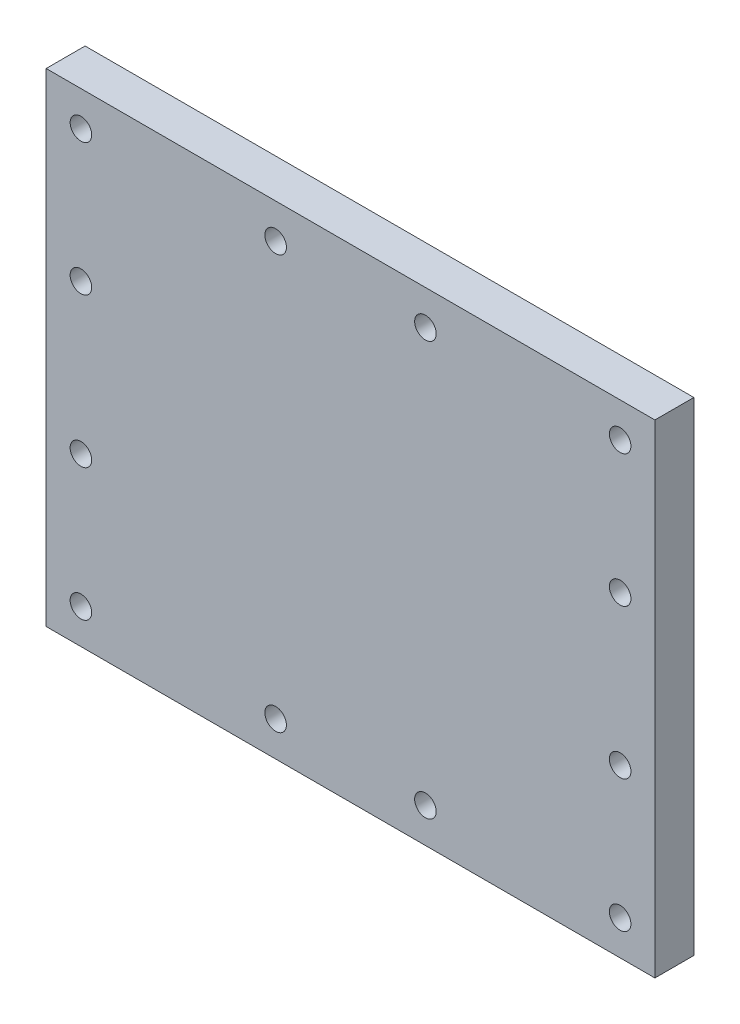
ISO-10303-21;
HEADER;
FILE_DESCRIPTION(('STEP AP214'),'2;1');
FILE_NAME('part.step','',(''),(''),'','','');
FILE_SCHEMA(('AUTOMOTIVE_DESIGN { 1 0 10303 214 1 1 1 1 }'));
ENDSEC;
DATA;
#1=APPLICATION_CONTEXT('core data for automotive mechanical design processes');
#2=APPLICATION_PROTOCOL_DEFINITION('international standard','automotive_design',2000,#1);
#3=PRODUCT_CONTEXT('',#1,'mechanical');
#4=PRODUCT('Part','Part','',(#3));
#5=PRODUCT_RELATED_PRODUCT_CATEGORY('part','',(#4));
#6=PRODUCT_DEFINITION_FORMATION('','',#4);
#7=PRODUCT_DEFINITION_CONTEXT('part definition',#1,'design');
#8=PRODUCT_DEFINITION('design','',#6,#7);
#9=PRODUCT_DEFINITION_SHAPE('','',#8);
#10=(LENGTH_UNIT() NAMED_UNIT(*) SI_UNIT(.MILLI.,.METRE.));
#11=(NAMED_UNIT(*) PLANE_ANGLE_UNIT() SI_UNIT($,.RADIAN.));
#12=(NAMED_UNIT(*) SI_UNIT($,.STERADIAN.) SOLID_ANGLE_UNIT());
#13=UNCERTAINTY_MEASURE_WITH_UNIT(LENGTH_MEASURE(1.E-05),#10,'distance_accuracy_value','');
#14=(GEOMETRIC_REPRESENTATION_CONTEXT(3) GLOBAL_UNCERTAINTY_ASSIGNED_CONTEXT((#13)) GLOBAL_UNIT_ASSIGNED_CONTEXT((#10,
#11,#12)) REPRESENTATION_CONTEXT('',''));
#15=CARTESIAN_POINT('',(0.,0.,0.));
#16=DIRECTION('',(0.,0.,1.));
#17=DIRECTION('',(1.,0.,0.));
#18=AXIS2_PLACEMENT_3D('',#15,#16,#17);
#19=CARTESIAN_POINT('',(-58.1243128246472,36.2443544247679,-5.51040500289528));
#20=DIRECTION('',(1.,0.,0.));
#21=DIRECTION('',(0.,1.,0.));
#22=AXIS2_PLACEMENT_3D('',#19,#20,#21);
#23=PLANE('',#22);
#24=DIRECTION('',(0.,-1.,0.));
#25=VECTOR('',#24,1.);
#26=CARTESIAN_POINT('',(-58.1243128246472,36.2443544247679,-11.1104050028953));
#27=LINE('',#26,#25);
#28=CARTESIAN_POINT('',(-58.1243128246472,105.741954424767,-11.1104050028953));
#29=VERTEX_POINT('',#28);
#30=CARTESIAN_POINT('',(-58.1243128246472,36.2443544247679,-11.1104050028953));
#31=VERTEX_POINT('',#30);
#32=EDGE_CURVE('E98',#29,#31,#27,.T.);
#33=ORIENTED_EDGE('',*,*,#32,.F.);
#34=DIRECTION('',(0.,0.,-1.));
#35=VECTOR('',#34,1.);
#36=CARTESIAN_POINT('',(-58.1243128246472,105.741954424767,-5.51040500289528));
#37=LINE('',#36,#35);
#38=CARTESIAN_POINT('',(-58.1243128246472,105.741954424767,-5.51040500289528));
#39=VERTEX_POINT('',#38);
#40=EDGE_CURVE('E11',#39,#29,#37,.T.);
#41=ORIENTED_EDGE('',*,*,#40,.F.);
#42=DIRECTION('',(0.,-1.,0.));
#43=VECTOR('',#42,1.);
#44=CARTESIAN_POINT('',(-58.1243128246472,36.2443544247679,-5.51040500289528));
#45=LINE('',#44,#43);
#46=CARTESIAN_POINT('',(-58.1243128246472,36.2443544247679,-5.51040500289528));
#47=VERTEX_POINT('',#46);
#48=EDGE_CURVE('E91',#39,#47,#45,.T.);
#49=ORIENTED_EDGE('',*,*,#48,.T.);
#50=DIRECTION('',(0.,0.,-1.));
#51=VECTOR('',#50,1.);
#52=CARTESIAN_POINT('',(-58.1243128246472,36.2443544247679,-5.51040500289528));
#53=LINE('',#52,#51);
#54=EDGE_CURVE('E36',#47,#31,#53,.T.);
#55=ORIENTED_EDGE('',*,*,#54,.T.);
#56=EDGE_LOOP('',(#33,#41,#49,#55));
#57=FACE_BOUND('',#56,.T.);
#58=ADVANCED_FACE('F33',(#57),#23,.T.);
#59=CARTESIAN_POINT('',(-58.1243128246472,105.741954424767,-5.51040500289528));
#60=DIRECTION('',(0.,1.,0.));
#61=DIRECTION('',(-1.,0.,0.));
#62=AXIS2_PLACEMENT_3D('',#59,#60,#61);
#63=PLANE('',#62);
#64=DIRECTION('',(1.,0.,0.));
#65=VECTOR('',#64,1.);
#66=CARTESIAN_POINT('',(-58.1243128246472,105.741954424767,-11.1104050028953));
#67=LINE('',#66,#65);
#68=CARTESIAN_POINT('',(-145.664312824647,105.741954424767,-11.1104050028953));
#69=VERTEX_POINT('',#68);
#70=EDGE_CURVE('E93',#69,#29,#67,.T.);
#71=ORIENTED_EDGE('',*,*,#70,.F.);
#72=DIRECTION('',(0.,0.,-1.));
#73=VECTOR('',#72,1.);
#74=CARTESIAN_POINT('',(-145.664312824647,105.741954424767,-5.51040500289528));
#75=LINE('',#74,#73);
#76=CARTESIAN_POINT('',(-145.664312824647,105.741954424767,-5.51040500289528));
#77=VERTEX_POINT('',#76);
#78=EDGE_CURVE('E42',#77,#69,#75,.T.);
#79=ORIENTED_EDGE('',*,*,#78,.F.);
#80=DIRECTION('',(1.,0.,0.));
#81=VECTOR('',#80,1.);
#82=CARTESIAN_POINT('',(-58.1243128246472,105.741954424767,-5.51040500289528));
#83=LINE('',#82,#81);
#84=EDGE_CURVE('E88',#77,#39,#83,.T.);
#85=ORIENTED_EDGE('',*,*,#84,.T.);
#86=ORIENTED_EDGE('',*,*,#40,.T.);
#87=EDGE_LOOP('',(#71,#79,#85,#86));
#88=FACE_BOUND('',#87,.T.);
#89=ADVANCED_FACE('F109',(#88),#63,.T.);
#90=CARTESIAN_POINT('',(-145.664312824647,36.2443544247679,-5.51040500289528));
#91=DIRECTION('',(-1.,0.,0.));
#92=DIRECTION('',(0.,0.,1.));
#93=AXIS2_PLACEMENT_3D('',#90,#91,#92);
#94=PLANE('',#93);
#95=DIRECTION('',(0.,1.,0.));
#96=VECTOR('',#95,1.);
#97=CARTESIAN_POINT('',(-145.664312824647,36.2443544247679,-11.1104050028953));
#98=LINE('',#97,#96);
#99=CARTESIAN_POINT('',(-145.664312824647,36.2443544247679,-11.1104050028953));
#100=VERTEX_POINT('',#99);
#101=EDGE_CURVE('E83',#100,#69,#98,.T.);
#102=ORIENTED_EDGE('',*,*,#101,.F.);
#103=DIRECTION('',(0.,0.,-1.));
#104=VECTOR('',#103,1.);
#105=CARTESIAN_POINT('',(-145.664312824647,36.2443544247679,-5.51040500289528));
#106=LINE('',#105,#104);
#107=CARTESIAN_POINT('',(-145.664312824647,36.2443544247679,-5.51040500289528));
#108=VERTEX_POINT('',#107);
#109=EDGE_CURVE('E78',#108,#100,#106,.T.);
#110=ORIENTED_EDGE('',*,*,#109,.F.);
#111=DIRECTION('',(0.,1.,0.));
#112=VECTOR('',#111,1.);
#113=CARTESIAN_POINT('',(-145.664312824647,36.2443544247679,-5.51040500289528));
#114=LINE('',#113,#112);
#115=EDGE_CURVE('E81',#108,#77,#114,.T.);
#116=ORIENTED_EDGE('',*,*,#115,.T.);
#117=ORIENTED_EDGE('',*,*,#78,.T.);
#118=EDGE_LOOP('',(#102,#110,#116,#117));
#119=FACE_BOUND('',#118,.T.);
#120=ADVANCED_FACE('F80',(#119),#94,.T.);
#121=CARTESIAN_POINT('',(-58.1243128246472,36.2443544247679,-5.51040500289528));
#122=DIRECTION('',(0.,-1.,0.));
#123=DIRECTION('',(1.,0.,0.));
#124=AXIS2_PLACEMENT_3D('',#121,#122,#123);
#125=PLANE('',#124);
#126=DIRECTION('',(-1.,0.,0.));
#127=VECTOR('',#126,1.);
#128=CARTESIAN_POINT('',(-58.1243128246472,36.2443544247679,-11.1104050028953));
#129=LINE('',#128,#127);
#130=EDGE_CURVE('E101',#31,#100,#129,.T.);
#131=ORIENTED_EDGE('',*,*,#130,.F.);
#132=ORIENTED_EDGE('',*,*,#54,.F.);
#133=DIRECTION('',(-1.,0.,0.));
#134=VECTOR('',#133,1.);
#135=CARTESIAN_POINT('',(-58.1243128246472,36.2443544247679,-5.51040500289528));
#136=LINE('',#135,#134);
#137=EDGE_CURVE('E87',#47,#108,#136,.T.);
#138=ORIENTED_EDGE('',*,*,#137,.T.);
#139=ORIENTED_EDGE('',*,*,#109,.T.);
#140=EDGE_LOOP('',(#131,#132,#138,#139));
#141=FACE_BOUND('',#140,.T.);
#142=ADVANCED_FACE('F90',(#141),#125,.T.);
#143=CARTESIAN_POINT('',(0.,0.,-5.51040500289528));
#144=DIRECTION('',(0.,0.,1.));
#145=DIRECTION('',(1.,0.,0.));
#146=AXIS2_PLACEMENT_3D('',#143,#144,#145);
#147=PLANE('',#146);
#148=CARTESIAN_POINT('',(-63.1243128246471,60.2443544247679,-5.51040500289528));
#149=DIRECTION('',(0.,0.,-1.));
#150=DIRECTION('',(-1.,0.,0.));
#151=AXIS2_PLACEMENT_3D('',#148,#149,#150);
#152=CIRCLE('',#151,1.54999999999999);
#153=CARTESIAN_POINT('',(-64.6743128246471,60.2443544247679,-5.51040500289528));
#154=VERTEX_POINT('',#153);
#155=EDGE_CURVE('E182',#154,#154,#152,.T.);
#156=ORIENTED_EDGE('',*,*,#155,.T.);
#157=EDGE_LOOP('',(#156));
#158=FACE_BOUND('',#157,.T.);
#159=CARTESIAN_POINT('',(-91.1243128246472,41.2443544247679,-5.51040500289528));
#160=DIRECTION('',(0.,0.,-1.));
#161=DIRECTION('',(-1.,0.,0.));
#162=AXIS2_PLACEMENT_3D('',#159,#160,#161);
#163=CIRCLE('',#162,1.54999999999999);
#164=CARTESIAN_POINT('',(-92.6743128246472,41.2443544247679,-5.51040500289528));
#165=VERTEX_POINT('',#164);
#166=EDGE_CURVE('E190',#165,#165,#163,.T.);
#167=ORIENTED_EDGE('',*,*,#166,.T.);
#168=EDGE_LOOP('',(#167));
#169=FACE_BOUND('',#168,.T.);
#170=CARTESIAN_POINT('',(-63.1243128246472,41.2443544247679,-5.51040500289528));
#171=DIRECTION('',(0.,0.,-1.));
#172=DIRECTION('',(-1.,0.,0.));
#173=AXIS2_PLACEMENT_3D('',#170,#171,#172);
#174=CIRCLE('',#173,1.54999999999999);
#175=CARTESIAN_POINT('',(-64.6743128246472,41.2443544247679,-5.51040500289528));
#176=VERTEX_POINT('',#175);
#177=EDGE_CURVE('E196',#176,#176,#174,.T.);
#178=ORIENTED_EDGE('',*,*,#177,.T.);
#179=EDGE_LOOP('',(#178));
#180=FACE_BOUND('',#179,.T.);
#181=CARTESIAN_POINT('',(-140.664312824647,81.7419544247674,-5.51040500289528));
#182=DIRECTION('',(0.,0.,-1.));
#183=DIRECTION('',(-1.,0.,0.));
#184=AXIS2_PLACEMENT_3D('',#181,#182,#183);
#185=CIRCLE('',#184,1.54999999999999);
#186=CARTESIAN_POINT('',(-142.214312824647,81.7419544247674,-5.51040500289528));
#187=VERTEX_POINT('',#186);
#188=EDGE_CURVE('E202',#187,#187,#185,.T.);
#189=ORIENTED_EDGE('',*,*,#188,.T.);
#190=EDGE_LOOP('',(#189));
#191=FACE_BOUND('',#190,.T.);
#192=CARTESIAN_POINT('',(-112.664312824647,100.741954424767,-5.51040500289528));
#193=DIRECTION('',(0.,0.,-1.));
#194=DIRECTION('',(-1.,0.,0.));
#195=AXIS2_PLACEMENT_3D('',#192,#193,#194);
#196=CIRCLE('',#195,1.54999999999999);
#197=CARTESIAN_POINT('',(-114.214312824647,100.741954424767,-5.51040500289528));
#198=VERTEX_POINT('',#197);
#199=EDGE_CURVE('E208',#198,#198,#196,.T.);
#200=ORIENTED_EDGE('',*,*,#199,.T.);
#201=EDGE_LOOP('',(#200));
#202=FACE_BOUND('',#201,.T.);
#203=CARTESIAN_POINT('',(-140.664312824647,100.741954424767,-5.51040500289528));
#204=DIRECTION('',(0.,0.,-1.));
#205=DIRECTION('',(-1.,0.,0.));
#206=AXIS2_PLACEMENT_3D('',#203,#204,#205);
#207=CIRCLE('',#206,1.54999999999999);
#208=CARTESIAN_POINT('',(-142.214312824647,100.741954424767,-5.51040500289528));
#209=VERTEX_POINT('',#208);
#210=EDGE_CURVE('E214',#209,#209,#207,.T.);
#211=ORIENTED_EDGE('',*,*,#210,.T.);
#212=EDGE_LOOP('',(#211));
#213=FACE_BOUND('',#212,.T.);
#214=CARTESIAN_POINT('',(-140.664312824647,41.2443544247679,-5.51040500289528));
#215=DIRECTION('',(0.,0.,-1.));
#216=DIRECTION('',(1.,0.,0.));
#217=AXIS2_PLACEMENT_3D('',#214,#215,#216);
#218=CIRCLE('',#217,1.54999999999999);
#219=CARTESIAN_POINT('',(-139.114312824647,41.2443544247679,-5.51040500289528));
#220=VERTEX_POINT('',#219);
#221=EDGE_CURVE('E220',#220,#220,#218,.T.);
#222=ORIENTED_EDGE('',*,*,#221,.T.);
#223=EDGE_LOOP('',(#222));
#224=FACE_BOUND('',#223,.T.);
#225=CARTESIAN_POINT('',(-112.664312824647,41.2443544247679,-5.51040500289528));
#226=DIRECTION('',(0.,0.,-1.));
#227=DIRECTION('',(1.,0.,0.));
#228=AXIS2_PLACEMENT_3D('',#225,#226,#227);
#229=CIRCLE('',#228,1.54999999999999);
#230=CARTESIAN_POINT('',(-111.114312824647,41.2443544247679,-5.51040500289528));
#231=VERTEX_POINT('',#230);
#232=EDGE_CURVE('E226',#231,#231,#229,.T.);
#233=ORIENTED_EDGE('',*,*,#232,.T.);
#234=EDGE_LOOP('',(#233));
#235=FACE_BOUND('',#234,.T.);
#236=CARTESIAN_POINT('',(-140.664312824647,60.2443544247679,-5.51040500289528));
#237=DIRECTION('',(0.,0.,-1.));
#238=DIRECTION('',(1.,0.,0.));
#239=AXIS2_PLACEMENT_3D('',#236,#237,#238);
#240=CIRCLE('',#239,1.54999999999999);
#241=CARTESIAN_POINT('',(-139.114312824647,60.2443544247679,-5.51040500289528));
#242=VERTEX_POINT('',#241);
#243=EDGE_CURVE('E232',#242,#242,#240,.T.);
#244=ORIENTED_EDGE('',*,*,#243,.T.);
#245=EDGE_LOOP('',(#244));
#246=FACE_BOUND('',#245,.T.);
#247=CARTESIAN_POINT('',(-63.1243128246472,100.741954424767,-5.51040500289528));
#248=DIRECTION('',(0.,0.,-1.));
#249=DIRECTION('',(1.,0.,0.));
#250=AXIS2_PLACEMENT_3D('',#247,#248,#249);
#251=CIRCLE('',#250,1.54999999999999);
#252=CARTESIAN_POINT('',(-61.5743128246472,100.741954424767,-5.51040500289528));
#253=VERTEX_POINT('',#252);
#254=EDGE_CURVE('E238',#253,#253,#251,.T.);
#255=ORIENTED_EDGE('',*,*,#254,.T.);
#256=EDGE_LOOP('',(#255));
#257=FACE_BOUND('',#256,.T.);
#258=CARTESIAN_POINT('',(-91.1243128246472,100.741954424767,-5.51040500289528));
#259=DIRECTION('',(0.,0.,-1.));
#260=DIRECTION('',(1.,0.,0.));
#261=AXIS2_PLACEMENT_3D('',#258,#259,#260);
#262=CIRCLE('',#261,1.54999999999999);
#263=CARTESIAN_POINT('',(-89.5743128246472,100.741954424767,-5.51040500289528));
#264=VERTEX_POINT('',#263);
#265=EDGE_CURVE('E244',#264,#264,#262,.T.);
#266=ORIENTED_EDGE('',*,*,#265,.T.);
#267=EDGE_LOOP('',(#266));
#268=FACE_BOUND('',#267,.T.);
#269=CARTESIAN_POINT('',(-63.1243128246471,81.7419544247674,-5.51040500289528));
#270=DIRECTION('',(0.,0.,-1.));
#271=DIRECTION('',(1.,0.,0.));
#272=AXIS2_PLACEMENT_3D('',#269,#270,#271);
#273=CIRCLE('',#272,1.54999999999999);
#274=CARTESIAN_POINT('',(-61.5743128246471,81.7419544247674,-5.51040500289528));
#275=VERTEX_POINT('',#274);
#276=EDGE_CURVE('E102',#275,#275,#273,.T.);
#277=ORIENTED_EDGE('',*,*,#276,.T.);
#278=EDGE_LOOP('',(#277));
#279=FACE_BOUND('',#278,.T.);
#280=ORIENTED_EDGE('',*,*,#48,.F.);
#281=ORIENTED_EDGE('',*,*,#84,.F.);
#282=ORIENTED_EDGE('',*,*,#115,.F.);
#283=ORIENTED_EDGE('',*,*,#137,.F.);
#284=EDGE_LOOP('',(#280,#281,#282,#283));
#285=FACE_BOUND('',#284,.T.);
#286=ADVANCED_FACE('F86',(#158,#169,#180,#191,#202,#213,#224,#235,#246,#257,#268,#279,#285),
#147,.T.);
#287=CARTESIAN_POINT('',(0.,0.,-11.1104050028953));
#288=DIRECTION('',(0.,0.,1.));
#289=DIRECTION('',(1.,0.,0.));
#290=AXIS2_PLACEMENT_3D('',#287,#288,#289);
#291=PLANE('',#290);
#292=CARTESIAN_POINT('',(-63.1243128246471,60.2443544247679,-11.1104050028953));
#293=DIRECTION('',(0.,0.,-1.));
#294=DIRECTION('',(-1.,0.,0.));
#295=AXIS2_PLACEMENT_3D('',#292,#293,#294);
#296=CIRCLE('',#295,1.54999999999999);
#297=CARTESIAN_POINT('',(-64.6743128246471,60.2443544247679,-11.1104050028953));
#298=VERTEX_POINT('',#297);
#299=EDGE_CURVE('E185',#298,#298,#296,.T.);
#300=ORIENTED_EDGE('',*,*,#299,.F.);
#301=EDGE_LOOP('',(#300));
#302=FACE_BOUND('',#301,.T.);
#303=CARTESIAN_POINT('',(-91.1243128246472,41.2443544247679,-11.1104050028953));
#304=DIRECTION('',(0.,0.,-1.));
#305=DIRECTION('',(-1.,0.,0.));
#306=AXIS2_PLACEMENT_3D('',#303,#304,#305);
#307=CIRCLE('',#306,1.54999999999999);
#308=CARTESIAN_POINT('',(-92.6743128246472,41.2443544247679,-11.1104050028953));
#309=VERTEX_POINT('',#308);
#310=EDGE_CURVE('E187',#309,#309,#307,.T.);
#311=ORIENTED_EDGE('',*,*,#310,.F.);
#312=EDGE_LOOP('',(#311));
#313=FACE_BOUND('',#312,.T.);
#314=CARTESIAN_POINT('',(-63.1243128246472,41.2443544247679,-11.1104050028953));
#315=DIRECTION('',(0.,0.,-1.));
#316=DIRECTION('',(-1.,0.,0.));
#317=AXIS2_PLACEMENT_3D('',#314,#315,#316);
#318=CIRCLE('',#317,1.54999999999999);
#319=CARTESIAN_POINT('',(-64.6743128246472,41.2443544247679,-11.1104050028953));
#320=VERTEX_POINT('',#319);
#321=EDGE_CURVE('E193',#320,#320,#318,.T.);
#322=ORIENTED_EDGE('',*,*,#321,.F.);
#323=EDGE_LOOP('',(#322));
#324=FACE_BOUND('',#323,.T.);
#325=CARTESIAN_POINT('',(-140.664312824647,81.7419544247674,-11.1104050028953));
#326=DIRECTION('',(0.,0.,-1.));
#327=DIRECTION('',(-1.,0.,0.));
#328=AXIS2_PLACEMENT_3D('',#325,#326,#327);
#329=CIRCLE('',#328,1.54999999999999);
#330=CARTESIAN_POINT('',(-142.214312824647,81.7419544247674,-11.1104050028953));
#331=VERTEX_POINT('',#330);
#332=EDGE_CURVE('E199',#331,#331,#329,.T.);
#333=ORIENTED_EDGE('',*,*,#332,.F.);
#334=EDGE_LOOP('',(#333));
#335=FACE_BOUND('',#334,.T.);
#336=CARTESIAN_POINT('',(-112.664312824647,100.741954424767,-11.1104050028953));
#337=DIRECTION('',(0.,0.,-1.));
#338=DIRECTION('',(-1.,0.,0.));
#339=AXIS2_PLACEMENT_3D('',#336,#337,#338);
#340=CIRCLE('',#339,1.54999999999999);
#341=CARTESIAN_POINT('',(-114.214312824647,100.741954424767,-11.1104050028953));
#342=VERTEX_POINT('',#341);
#343=EDGE_CURVE('E205',#342,#342,#340,.T.);
#344=ORIENTED_EDGE('',*,*,#343,.F.);
#345=EDGE_LOOP('',(#344));
#346=FACE_BOUND('',#345,.T.);
#347=CARTESIAN_POINT('',(-140.664312824647,100.741954424767,-11.1104050028953));
#348=DIRECTION('',(0.,0.,-1.));
#349=DIRECTION('',(-1.,0.,0.));
#350=AXIS2_PLACEMENT_3D('',#347,#348,#349);
#351=CIRCLE('',#350,1.54999999999999);
#352=CARTESIAN_POINT('',(-142.214312824647,100.741954424767,-11.1104050028953));
#353=VERTEX_POINT('',#352);
#354=EDGE_CURVE('E211',#353,#353,#351,.T.);
#355=ORIENTED_EDGE('',*,*,#354,.F.);
#356=EDGE_LOOP('',(#355));
#357=FACE_BOUND('',#356,.T.);
#358=CARTESIAN_POINT('',(-140.664312824647,41.2443544247679,-11.1104050028953));
#359=DIRECTION('',(0.,0.,-1.));
#360=DIRECTION('',(1.,0.,0.));
#361=AXIS2_PLACEMENT_3D('',#358,#359,#360);
#362=CIRCLE('',#361,1.54999999999999);
#363=CARTESIAN_POINT('',(-139.114312824647,41.2443544247679,-11.1104050028953));
#364=VERTEX_POINT('',#363);
#365=EDGE_CURVE('E217',#364,#364,#362,.T.);
#366=ORIENTED_EDGE('',*,*,#365,.F.);
#367=EDGE_LOOP('',(#366));
#368=FACE_BOUND('',#367,.T.);
#369=CARTESIAN_POINT('',(-112.664312824647,41.2443544247679,-11.1104050028953));
#370=DIRECTION('',(0.,0.,-1.));
#371=DIRECTION('',(1.,0.,0.));
#372=AXIS2_PLACEMENT_3D('',#369,#370,#371);
#373=CIRCLE('',#372,1.54999999999999);
#374=CARTESIAN_POINT('',(-111.114312824647,41.2443544247679,-11.1104050028953));
#375=VERTEX_POINT('',#374);
#376=EDGE_CURVE('E223',#375,#375,#373,.T.);
#377=ORIENTED_EDGE('',*,*,#376,.F.);
#378=EDGE_LOOP('',(#377));
#379=FACE_BOUND('',#378,.T.);
#380=CARTESIAN_POINT('',(-140.664312824647,60.2443544247679,-11.1104050028953));
#381=DIRECTION('',(0.,0.,-1.));
#382=DIRECTION('',(1.,0.,0.));
#383=AXIS2_PLACEMENT_3D('',#380,#381,#382);
#384=CIRCLE('',#383,1.54999999999999);
#385=CARTESIAN_POINT('',(-139.114312824647,60.2443544247679,-11.1104050028953));
#386=VERTEX_POINT('',#385);
#387=EDGE_CURVE('E229',#386,#386,#384,.T.);
#388=ORIENTED_EDGE('',*,*,#387,.F.);
#389=EDGE_LOOP('',(#388));
#390=FACE_BOUND('',#389,.T.);
#391=CARTESIAN_POINT('',(-63.1243128246472,100.741954424767,-11.1104050028953));
#392=DIRECTION('',(0.,0.,-1.));
#393=DIRECTION('',(1.,0.,0.));
#394=AXIS2_PLACEMENT_3D('',#391,#392,#393);
#395=CIRCLE('',#394,1.54999999999999);
#396=CARTESIAN_POINT('',(-61.5743128246472,100.741954424767,-11.1104050028953));
#397=VERTEX_POINT('',#396);
#398=EDGE_CURVE('E235',#397,#397,#395,.T.);
#399=ORIENTED_EDGE('',*,*,#398,.F.);
#400=EDGE_LOOP('',(#399));
#401=FACE_BOUND('',#400,.T.);
#402=CARTESIAN_POINT('',(-91.1243128246472,100.741954424767,-11.1104050028953));
#403=DIRECTION('',(0.,0.,-1.));
#404=DIRECTION('',(1.,0.,0.));
#405=AXIS2_PLACEMENT_3D('',#402,#403,#404);
#406=CIRCLE('',#405,1.54999999999999);
#407=CARTESIAN_POINT('',(-89.5743128246472,100.741954424767,-11.1104050028953));
#408=VERTEX_POINT('',#407);
#409=EDGE_CURVE('E241',#408,#408,#406,.T.);
#410=ORIENTED_EDGE('',*,*,#409,.F.);
#411=EDGE_LOOP('',(#410));
#412=FACE_BOUND('',#411,.T.);
#413=CARTESIAN_POINT('',(-63.1243128246471,81.7419544247674,-11.1104050028953));
#414=DIRECTION('',(0.,0.,-1.));
#415=DIRECTION('',(1.,0.,0.));
#416=AXIS2_PLACEMENT_3D('',#413,#414,#415);
#417=CIRCLE('',#416,1.54999999999999);
#418=CARTESIAN_POINT('',(-61.5743128246471,81.7419544247674,-11.1104050028953));
#419=VERTEX_POINT('',#418);
#420=EDGE_CURVE('E247',#419,#419,#417,.T.);
#421=ORIENTED_EDGE('',*,*,#420,.F.);
#422=EDGE_LOOP('',(#421));
#423=FACE_BOUND('',#422,.T.);
#424=ORIENTED_EDGE('',*,*,#32,.T.);
#425=ORIENTED_EDGE('',*,*,#130,.T.);
#426=ORIENTED_EDGE('',*,*,#101,.T.);
#427=ORIENTED_EDGE('',*,*,#70,.T.);
#428=EDGE_LOOP('',(#424,#425,#426,#427));
#429=FACE_BOUND('',#428,.T.);
#430=ADVANCED_FACE('F108',(#302,#313,#324,#335,#346,#357,#368,#379,#390,#401,#412,#423,#429),
#291,.F.);
#431=CARTESIAN_POINT('',(-63.1243128246471,81.7419544247674,-5.51040500289528));
#432=DIRECTION('',(0.,0.,-1.));
#433=DIRECTION('',(-1.,0.,0.));
#434=AXIS2_PLACEMENT_3D('',#431,#432,#433);
#435=CYLINDRICAL_SURFACE('',#434,1.54999999999999);
#436=ORIENTED_EDGE('',*,*,#276,.F.);
#437=EDGE_LOOP('',(#436));
#438=FACE_BOUND('',#437,.T.);
#439=ORIENTED_EDGE('',*,*,#420,.T.);
#440=EDGE_LOOP('',(#439));
#441=FACE_BOUND('',#440,.T.);
#442=ADVANCED_FACE('F127',(#438,#441),#435,.F.);
#443=CARTESIAN_POINT('',(-91.1243128246472,100.741954424767,-5.51040500289528));
#444=DIRECTION('',(0.,0.,-1.));
#445=DIRECTION('',(-1.,0.,0.));
#446=AXIS2_PLACEMENT_3D('',#443,#444,#445);
#447=CYLINDRICAL_SURFACE('',#446,1.54999999999999);
#448=ORIENTED_EDGE('',*,*,#265,.F.);
#449=EDGE_LOOP('',(#448));
#450=FACE_BOUND('',#449,.T.);
#451=ORIENTED_EDGE('',*,*,#409,.T.);
#452=EDGE_LOOP('',(#451));
#453=FACE_BOUND('',#452,.T.);
#454=ADVANCED_FACE('F134',(#450,#453),#447,.F.);
#455=CARTESIAN_POINT('',(-63.1243128246472,100.741954424767,-5.51040500289528));
#456=DIRECTION('',(0.,0.,-1.));
#457=DIRECTION('',(-1.,0.,0.));
#458=AXIS2_PLACEMENT_3D('',#455,#456,#457);
#459=CYLINDRICAL_SURFACE('',#458,1.54999999999999);
#460=ORIENTED_EDGE('',*,*,#254,.F.);
#461=EDGE_LOOP('',(#460));
#462=FACE_BOUND('',#461,.T.);
#463=ORIENTED_EDGE('',*,*,#398,.T.);
#464=EDGE_LOOP('',(#463));
#465=FACE_BOUND('',#464,.T.);
#466=ADVANCED_FACE('F138',(#462,#465),#459,.F.);
#467=CARTESIAN_POINT('',(-140.664312824647,60.2443544247679,-5.51040500289528));
#468=DIRECTION('',(0.,0.,-1.));
#469=DIRECTION('',(-1.,0.,0.));
#470=AXIS2_PLACEMENT_3D('',#467,#468,#469);
#471=CYLINDRICAL_SURFACE('',#470,1.54999999999999);
#472=ORIENTED_EDGE('',*,*,#243,.F.);
#473=EDGE_LOOP('',(#472));
#474=FACE_BOUND('',#473,.T.);
#475=ORIENTED_EDGE('',*,*,#387,.T.);
#476=EDGE_LOOP('',(#475));
#477=FACE_BOUND('',#476,.T.);
#478=ADVANCED_FACE('F142',(#474,#477),#471,.F.);
#479=CARTESIAN_POINT('',(-112.664312824647,41.2443544247679,-5.51040500289528));
#480=DIRECTION('',(0.,0.,-1.));
#481=DIRECTION('',(-1.,0.,0.));
#482=AXIS2_PLACEMENT_3D('',#479,#480,#481);
#483=CYLINDRICAL_SURFACE('',#482,1.54999999999999);
#484=ORIENTED_EDGE('',*,*,#232,.F.);
#485=EDGE_LOOP('',(#484));
#486=FACE_BOUND('',#485,.T.);
#487=ORIENTED_EDGE('',*,*,#376,.T.);
#488=EDGE_LOOP('',(#487));
#489=FACE_BOUND('',#488,.T.);
#490=ADVANCED_FACE('F146',(#486,#489),#483,.F.);
#491=CARTESIAN_POINT('',(-140.664312824647,41.2443544247679,-5.51040500289528));
#492=DIRECTION('',(0.,0.,-1.));
#493=DIRECTION('',(-1.,0.,0.));
#494=AXIS2_PLACEMENT_3D('',#491,#492,#493);
#495=CYLINDRICAL_SURFACE('',#494,1.54999999999999);
#496=ORIENTED_EDGE('',*,*,#221,.F.);
#497=EDGE_LOOP('',(#496));
#498=FACE_BOUND('',#497,.T.);
#499=ORIENTED_EDGE('',*,*,#365,.T.);
#500=EDGE_LOOP('',(#499));
#501=FACE_BOUND('',#500,.T.);
#502=ADVANCED_FACE('F150',(#498,#501),#495,.F.);
#503=CARTESIAN_POINT('',(-140.664312824647,100.741954424767,-5.51040500289528));
#504=DIRECTION('',(0.,0.,-1.));
#505=DIRECTION('',(-1.,0.,0.));
#506=AXIS2_PLACEMENT_3D('',#503,#504,#505);
#507=CYLINDRICAL_SURFACE('',#506,1.54999999999999);
#508=ORIENTED_EDGE('',*,*,#210,.F.);
#509=EDGE_LOOP('',(#508));
#510=FACE_BOUND('',#509,.T.);
#511=ORIENTED_EDGE('',*,*,#354,.T.);
#512=EDGE_LOOP('',(#511));
#513=FACE_BOUND('',#512,.T.);
#514=ADVANCED_FACE('F154',(#510,#513),#507,.F.);
#515=CARTESIAN_POINT('',(-112.664312824647,100.741954424767,-5.51040500289528));
#516=DIRECTION('',(0.,0.,-1.));
#517=DIRECTION('',(-1.,0.,0.));
#518=AXIS2_PLACEMENT_3D('',#515,#516,#517);
#519=CYLINDRICAL_SURFACE('',#518,1.54999999999999);
#520=ORIENTED_EDGE('',*,*,#199,.F.);
#521=EDGE_LOOP('',(#520));
#522=FACE_BOUND('',#521,.T.);
#523=ORIENTED_EDGE('',*,*,#343,.T.);
#524=EDGE_LOOP('',(#523));
#525=FACE_BOUND('',#524,.T.);
#526=ADVANCED_FACE('F158',(#522,#525),#519,.F.);
#527=CARTESIAN_POINT('',(-140.664312824647,81.7419544247674,-5.51040500289528));
#528=DIRECTION('',(0.,0.,-1.));
#529=DIRECTION('',(-1.,0.,0.));
#530=AXIS2_PLACEMENT_3D('',#527,#528,#529);
#531=CYLINDRICAL_SURFACE('',#530,1.54999999999999);
#532=ORIENTED_EDGE('',*,*,#188,.F.);
#533=EDGE_LOOP('',(#532));
#534=FACE_BOUND('',#533,.T.);
#535=ORIENTED_EDGE('',*,*,#332,.T.);
#536=EDGE_LOOP('',(#535));
#537=FACE_BOUND('',#536,.T.);
#538=ADVANCED_FACE('F162',(#534,#537),#531,.F.);
#539=CARTESIAN_POINT('',(-63.1243128246472,41.2443544247679,-5.51040500289528));
#540=DIRECTION('',(0.,0.,-1.));
#541=DIRECTION('',(-1.,0.,0.));
#542=AXIS2_PLACEMENT_3D('',#539,#540,#541);
#543=CYLINDRICAL_SURFACE('',#542,1.54999999999999);
#544=ORIENTED_EDGE('',*,*,#177,.F.);
#545=EDGE_LOOP('',(#544));
#546=FACE_BOUND('',#545,.T.);
#547=ORIENTED_EDGE('',*,*,#321,.T.);
#548=EDGE_LOOP('',(#547));
#549=FACE_BOUND('',#548,.T.);
#550=ADVANCED_FACE('F166',(#546,#549),#543,.F.);
#551=CARTESIAN_POINT('',(-91.1243128246472,41.2443544247679,-5.51040500289528));
#552=DIRECTION('',(0.,0.,-1.));
#553=DIRECTION('',(-1.,0.,0.));
#554=AXIS2_PLACEMENT_3D('',#551,#552,#553);
#555=CYLINDRICAL_SURFACE('',#554,1.54999999999999);
#556=ORIENTED_EDGE('',*,*,#166,.F.);
#557=EDGE_LOOP('',(#556));
#558=FACE_BOUND('',#557,.T.);
#559=ORIENTED_EDGE('',*,*,#310,.T.);
#560=EDGE_LOOP('',(#559));
#561=FACE_BOUND('',#560,.T.);
#562=ADVANCED_FACE('F170',(#558,#561),#555,.F.);
#563=CARTESIAN_POINT('',(-63.1243128246471,60.2443544247679,-5.51040500289528));
#564=DIRECTION('',(0.,0.,-1.));
#565=DIRECTION('',(-1.,0.,0.));
#566=AXIS2_PLACEMENT_3D('',#563,#564,#565);
#567=CYLINDRICAL_SURFACE('',#566,1.54999999999999);
#568=ORIENTED_EDGE('',*,*,#155,.F.);
#569=EDGE_LOOP('',(#568));
#570=FACE_BOUND('',#569,.T.);
#571=ORIENTED_EDGE('',*,*,#299,.T.);
#572=EDGE_LOOP('',(#571));
#573=FACE_BOUND('',#572,.T.);
#574=ADVANCED_FACE('F174',(#570,#573),#567,.F.);
#575=CLOSED_SHELL('',(#58,#89,#120,#142,#286,#430,#442,#454,#466,#478,#490,#502,#514,#526,#538,
#550,#562,#574));
#576=MANIFOLD_SOLID_BREP('B2',#575);
#577=ADVANCED_BREP_SHAPE_REPRESENTATION('',(#18,#576),#14);
#578=SHAPE_DEFINITION_REPRESENTATION(#9,#577);
ENDSEC;
END-ISO-10303-21;
